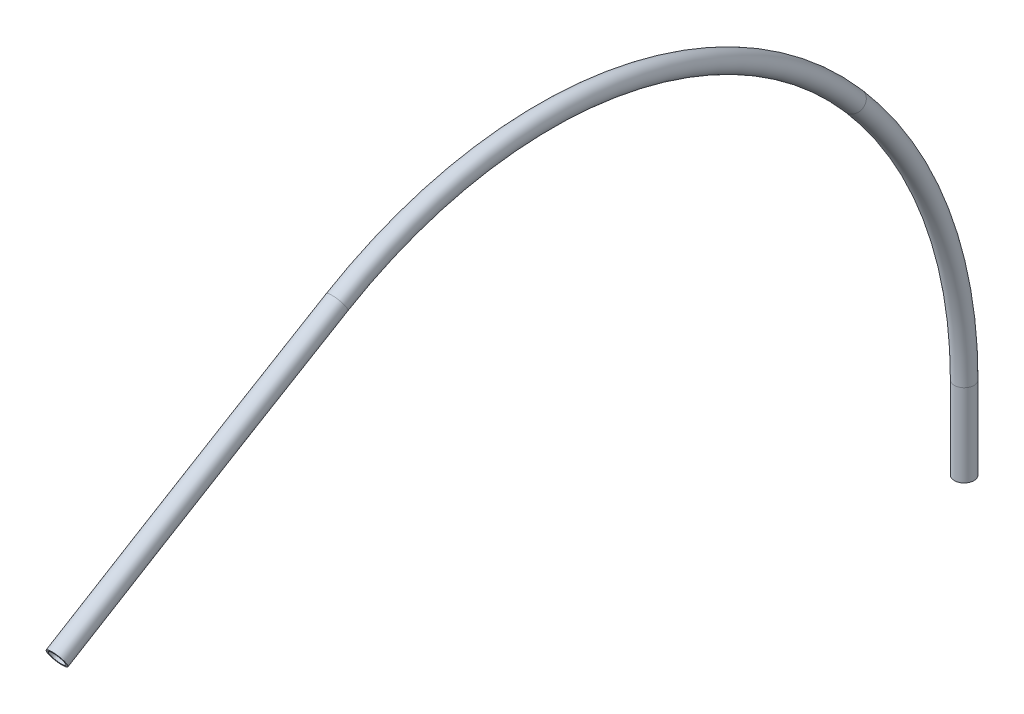
ISO-10303-21;
HEADER;
FILE_DESCRIPTION(('STEP AP214'),'2;1');
FILE_NAME('part.step','',(''),(''),'','','');
FILE_SCHEMA(('AUTOMOTIVE_DESIGN { 1 0 10303 214 1 1 1 1 }'));
ENDSEC;
DATA;
#1=APPLICATION_CONTEXT('core data for automotive mechanical design processes');
#2=APPLICATION_PROTOCOL_DEFINITION('international standard','automotive_design',2000,#1);
#3=PRODUCT_CONTEXT('',#1,'mechanical');
#4=PRODUCT('Part','Part','',(#3));
#5=PRODUCT_RELATED_PRODUCT_CATEGORY('part','',(#4));
#6=PRODUCT_DEFINITION_FORMATION('','',#4);
#7=PRODUCT_DEFINITION_CONTEXT('part definition',#1,'design');
#8=PRODUCT_DEFINITION('design','',#6,#7);
#9=PRODUCT_DEFINITION_SHAPE('','',#8);
#10=(LENGTH_UNIT() NAMED_UNIT(*) SI_UNIT(.MILLI.,.METRE.));
#11=(NAMED_UNIT(*) PLANE_ANGLE_UNIT() SI_UNIT($,.RADIAN.));
#12=(NAMED_UNIT(*) SI_UNIT($,.STERADIAN.) SOLID_ANGLE_UNIT());
#13=UNCERTAINTY_MEASURE_WITH_UNIT(LENGTH_MEASURE(1.E-05),#10,'distance_accuracy_value','');
#14=(GEOMETRIC_REPRESENTATION_CONTEXT(3) GLOBAL_UNCERTAINTY_ASSIGNED_CONTEXT((#13)) GLOBAL_UNIT_ASSIGNED_CONTEXT((#10,
#11,#12)) REPRESENTATION_CONTEXT('',''));
#15=CARTESIAN_POINT('',(0.,0.,0.));
#16=DIRECTION('',(0.,0.,1.));
#17=DIRECTION('',(1.,0.,0.));
#18=AXIS2_PLACEMENT_3D('',#15,#16,#17);
#19=CARTESIAN_POINT('',(0.,-11016.717542219,-6364.23470529255));
#20=DIRECTION('',(1.,0.,0.));
#21=DIRECTION('',(0.,0.,-1.));
#22=AXIS2_PLACEMENT_3D('',#19,#20,#21);
#23=TOROIDAL_SURFACE('',#22,13130.1715772297,5.);
#24=CARTESIAN_POINT('',(0.,277.064656452834,332.92060845467));
#25=DIRECTION('',(0.,-0.510058476719484,0.860139727210992));
#26=DIRECTION('',(0.,-0.860139727210992,-0.510058476719484));
#27=AXIS2_PLACEMENT_3D('',#24,#25,#26);
#28=CIRCLE('',#27,5.);
#29=CARTESIAN_POINT('',(0.,281.365355088891,335.470900838268));
#30=VERTEX_POINT('',#29);
#31=EDGE_CURVE('E38',#30,#30,#28,.T.);
#32=CARTESIAN_POINT('',(0.,190.846879685451,476.226198502676));
#33=DIRECTION('',(0.,-0.520972697390943,0.853573341062855));
#34=DIRECTION('',(0.,-0.853573341062855,-0.520972697390943));
#35=AXIS2_PLACEMENT_3D('',#32,#33,#34);
#36=CIRCLE('',#35,5.);
#37=CARTESIAN_POINT('',(0.,195.114746390765,478.83106198963));
#38=VERTEX_POINT('',#37);
#39=EDGE_CURVE('E10',#38,#38,#36,.T.);
#40=CARTESIAN_POINT('',(0.,-11016.717542219,-6364.23470529255));
#41=DIRECTION('',(1.,0.,0.));
#42=DIRECTION('',(0.,0.,-1.));
#43=AXIS2_PLACEMENT_3D('',#40,#41,#42);
#44=CIRCLE('',#43,13135.1715772297);
#45=EDGE_CURVE('',#30,#38,#44,.T.);
#46=ORIENTED_EDGE('',*,*,#31,.T.);
#47=ORIENTED_EDGE('',*,*,#39,.F.);
#48=ORIENTED_EDGE('',*,*,#45,.T.);
#49=ORIENTED_EDGE('',*,*,#45,.F.);
#50=EDGE_LOOP('',(#46,#48,#47,#49));
#51=FACE_BOUND('',#50,.T.);
#52=ADVANCED_FACE('F32',(#51),#23,.T.);
#53=CARTESIAN_POINT('',(0.,97.5047973276832,226.442526664043));
#54=DIRECTION('',(1.,0.,0.));
#55=DIRECTION('',(0.,0.,-1.));
#56=AXIS2_PLACEMENT_3D('',#53,#54,#55);
#57=TOROIDAL_SURFACE('',#56,208.756616448091,5.);
#58=CARTESIAN_POINT('',(0.,233.840270104142,68.3540584771607));
#59=DIRECTION('',(0.,0.757286024638133,0.653083361361911));
#60=DIRECTION('',(0.,-0.653083361361911,0.757286024638133));
#61=AXIS2_PLACEMENT_3D('',#58,#59,#60);
#62=CIRCLE('',#61,5.);
#63=CARTESIAN_POINT('',(0.,237.105686910951,64.56762835397));
#64=VERTEX_POINT('',#63);
#65=EDGE_CURVE('E42',#64,#64,#62,.T.);
#66=CARTESIAN_POINT('',(0.,97.5047973276832,226.442526664043));
#67=DIRECTION('',(1.,0.,0.));
#68=DIRECTION('',(0.,0.,-1.));
#69=AXIS2_PLACEMENT_3D('',#66,#67,#68);
#70=CIRCLE('',#69,213.756616448091);
#71=EDGE_CURVE('',#64,#30,#70,.T.);
#72=ORIENTED_EDGE('',*,*,#65,.T.);
#73=ORIENTED_EDGE('',*,*,#31,.F.);
#74=ORIENTED_EDGE('',*,*,#71,.T.);
#75=ORIENTED_EDGE('',*,*,#71,.F.);
#76=EDGE_LOOP('',(#72,#74,#73,#75));
#77=FACE_BOUND('',#76,.T.);
#78=ADVANCED_FACE('F94',(#77),#57,.T.);
#79=CARTESIAN_POINT('',(0.,82.2054172623216,244.182998087117));
#80=DIRECTION('',(1.,0.,0.));
#81=DIRECTION('',(0.,0.,-1.));
#82=AXIS2_PLACEMENT_3D('',#79,#80,#81);
#83=TOROIDAL_SURFACE('',#82,232.182998087117,5.);
#84=CARTESIAN_POINT('',(0.,82.2054172623216,12.));
#85=DIRECTION('',(0.,1.,0.));
#86=DIRECTION('',(0.,0.,1.));
#87=AXIS2_PLACEMENT_3D('',#84,#85,#86);
#88=CIRCLE('',#87,5.);
#89=CARTESIAN_POINT('',(0.,82.2054172623216,7.00000000000001));
#90=VERTEX_POINT('',#89);
#91=EDGE_CURVE('E46',#90,#90,#88,.T.);
#92=CARTESIAN_POINT('',(0.,82.2054172623216,244.182998087117));
#93=DIRECTION('',(1.,0.,0.));
#94=DIRECTION('',(0.,0.,-1.));
#95=AXIS2_PLACEMENT_3D('',#92,#93,#94);
#96=CIRCLE('',#95,237.182998087117);
#97=EDGE_CURVE('',#90,#64,#96,.T.);
#98=ORIENTED_EDGE('',*,*,#91,.T.);
#99=ORIENTED_EDGE('',*,*,#65,.F.);
#100=ORIENTED_EDGE('',*,*,#97,.T.);
#101=ORIENTED_EDGE('',*,*,#97,.F.);
#102=EDGE_LOOP('',(#98,#100,#99,#101));
#103=FACE_BOUND('',#102,.T.);
#104=ADVANCED_FACE('F89',(#103),#83,.T.);
#105=CARTESIAN_POINT('',(0.,82.2054172623216,12.));
#106=DIRECTION('',(0.,-1.,0.));
#107=DIRECTION('',(0.,0.,-1.));
#108=AXIS2_PLACEMENT_3D('',#105,#106,#107);
#109=CYLINDRICAL_SURFACE('',#108,5.);
#110=ORIENTED_EDGE('',*,*,#91,.F.);
#111=EDGE_LOOP('',(#110));
#112=FACE_BOUND('',#111,.T.);
#113=CARTESIAN_POINT('',(0.,40.,12.));
#114=DIRECTION('',(0.,1.,0.));
#115=DIRECTION('',(0.,0.,1.));
#116=AXIS2_PLACEMENT_3D('',#113,#114,#115);
#117=CIRCLE('',#116,5.);
#118=CARTESIAN_POINT('',(0.,40.,17.));
#119=VERTEX_POINT('',#118);
#120=EDGE_CURVE('E49',#119,#119,#117,.T.);
#121=ORIENTED_EDGE('',*,*,#120,.T.);
#122=EDGE_LOOP('',(#121));
#123=FACE_BOUND('',#122,.T.);
#124=ADVANCED_FACE('F81',(#112,#123),#109,.T.);
#125=CARTESIAN_POINT('',(0.,190.846879685451,476.226198502676));
#126=DIRECTION('',(0.,-0.520972697390943,0.853573341062855));
#127=DIRECTION('',(0.,-0.853573341062855,-0.520972697390943));
#128=AXIS2_PLACEMENT_3D('',#125,#126,#127);
#129=PLANE('',#128);
#130=CARTESIAN_POINT('',(0.,190.846879685449,476.226198502679));
#131=DIRECTION('',(0.,-0.520972697390943,0.853573341062855));
#132=DIRECTION('',(0.,-0.853573341062855,-0.520972697390943));
#133=AXIS2_PLACEMENT_3D('',#130,#131,#132);
#134=CIRCLE('',#133,4.);
#135=CARTESIAN_POINT('',(0.,194.261173049698,478.310089292242));
#136=VERTEX_POINT('',#135);
#137=EDGE_CURVE('E52',#136,#136,#134,.T.);
#138=ORIENTED_EDGE('',*,*,#137,.F.);
#139=EDGE_LOOP('',(#138));
#140=FACE_BOUND('',#139,.T.);
#141=ORIENTED_EDGE('',*,*,#39,.T.);
#142=EDGE_LOOP('',(#141));
#143=FACE_BOUND('',#142,.T.);
#144=ADVANCED_FACE('F79',(#140,#143),#129,.T.);
#145=CARTESIAN_POINT('',(0.,40.,12.));
#146=DIRECTION('',(0.,1.,0.));
#147=DIRECTION('',(0.,0.,1.));
#148=AXIS2_PLACEMENT_3D('',#145,#146,#147);
#149=PLANE('',#148);
#150=CARTESIAN_POINT('',(0.,40.,12.));
#151=DIRECTION('',(0.,1.,0.));
#152=DIRECTION('',(0.,0.,1.));
#153=AXIS2_PLACEMENT_3D('',#150,#151,#152);
#154=CIRCLE('',#153,4.);
#155=CARTESIAN_POINT('',(0.,40.,16.));
#156=VERTEX_POINT('',#155);
#157=EDGE_CURVE('E55',#156,#156,#154,.T.);
#158=ORIENTED_EDGE('',*,*,#157,.T.);
#159=EDGE_LOOP('',(#158));
#160=FACE_BOUND('',#159,.T.);
#161=ORIENTED_EDGE('',*,*,#120,.F.);
#162=EDGE_LOOP('',(#161));
#163=FACE_BOUND('',#162,.T.);
#164=ADVANCED_FACE('F75',(#160,#163),#149,.F.);
#165=CARTESIAN_POINT('',(0.,-11016.717542219,-6364.23470529255));
#166=DIRECTION('',(1.,0.,0.));
#167=DIRECTION('',(0.,0.,-1.));
#168=AXIS2_PLACEMENT_3D('',#165,#166,#167);
#169=TOROIDAL_SURFACE('',#168,13130.1715772297,4.);
#170=CARTESIAN_POINT('',(0.,277.064656452835,332.92060845467));
#171=DIRECTION('',(0.,0.510058476719484,-0.860139727210992));
#172=DIRECTION('',(0.,0.860139727210992,0.510058476719484));
#173=AXIS2_PLACEMENT_3D('',#170,#171,#172);
#174=CIRCLE('',#173,4.);
#175=CARTESIAN_POINT('',(0.,280.505215361678,334.960842361548));
#176=VERTEX_POINT('',#175);
#177=EDGE_CURVE('E61',#176,#176,#174,.F.);
#178=CARTESIAN_POINT('',(0.,-11016.717542219,-6364.23470529255));
#179=DIRECTION('',(1.,0.,0.));
#180=DIRECTION('',(0.,0.,-1.));
#181=AXIS2_PLACEMENT_3D('',#178,#179,#180);
#182=CIRCLE('',#181,13134.1715772297);
#183=EDGE_CURVE('',#176,#136,#182,.T.);
#184=ORIENTED_EDGE('',*,*,#177,.F.);
#185=ORIENTED_EDGE('',*,*,#137,.T.);
#186=ORIENTED_EDGE('',*,*,#183,.T.);
#187=ORIENTED_EDGE('',*,*,#183,.F.);
#188=EDGE_LOOP('',(#184,#186,#185,#187));
#189=FACE_BOUND('',#188,.T.);
#190=ADVANCED_FACE('F72',(#189),#169,.F.);
#191=CARTESIAN_POINT('',(0.,97.5047973276832,226.442526664043));
#192=DIRECTION('',(1.,0.,0.));
#193=DIRECTION('',(0.,0.,-1.));
#194=AXIS2_PLACEMENT_3D('',#191,#192,#193);
#195=TOROIDAL_SURFACE('',#194,208.756616448091,4.);
#196=CARTESIAN_POINT('',(0.,233.840270104142,68.3540584771607));
#197=DIRECTION('',(0.,-0.757286024638133,-0.653083361361911));
#198=DIRECTION('',(0.,0.653083361361911,-0.757286024638133));
#199=AXIS2_PLACEMENT_3D('',#196,#197,#198);
#200=CIRCLE('',#199,4.);
#201=CARTESIAN_POINT('',(0.,236.452603549589,65.3249143786082));
#202=VERTEX_POINT('',#201);
#203=EDGE_CURVE('E64',#202,#202,#200,.F.);
#204=CARTESIAN_POINT('',(0.,97.5047973276832,226.442526664043));
#205=DIRECTION('',(1.,0.,0.));
#206=DIRECTION('',(0.,0.,-1.));
#207=AXIS2_PLACEMENT_3D('',#204,#205,#206);
#208=CIRCLE('',#207,212.756616448091);
#209=EDGE_CURVE('',#202,#176,#208,.T.);
#210=ORIENTED_EDGE('',*,*,#203,.F.);
#211=ORIENTED_EDGE('',*,*,#177,.T.);
#212=ORIENTED_EDGE('',*,*,#209,.T.);
#213=ORIENTED_EDGE('',*,*,#209,.F.);
#214=EDGE_LOOP('',(#210,#212,#211,#213));
#215=FACE_BOUND('',#214,.T.);
#216=ADVANCED_FACE('F70',(#215),#195,.F.);
#217=CARTESIAN_POINT('',(0.,82.2054172623216,244.182998087117));
#218=DIRECTION('',(1.,0.,0.));
#219=DIRECTION('',(0.,0.,-1.));
#220=AXIS2_PLACEMENT_3D('',#217,#218,#219);
#221=TOROIDAL_SURFACE('',#220,232.182998087117,4.);
#222=CARTESIAN_POINT('',(0.,82.2054172623216,12.));
#223=DIRECTION('',(0.,-1.,0.));
#224=DIRECTION('',(0.,0.,-1.));
#225=AXIS2_PLACEMENT_3D('',#222,#223,#224);
#226=CIRCLE('',#225,4.);
#227=CARTESIAN_POINT('',(0.,82.2054172623216,8.00000000000001));
#228=VERTEX_POINT('',#227);
#229=EDGE_CURVE('E58',#228,#228,#226,.F.);
#230=CARTESIAN_POINT('',(0.,82.2054172623216,244.182998087117));
#231=DIRECTION('',(1.,0.,0.));
#232=DIRECTION('',(0.,0.,-1.));
#233=AXIS2_PLACEMENT_3D('',#230,#231,#232);
#234=CIRCLE('',#233,236.182998087117);
#235=EDGE_CURVE('',#228,#202,#234,.T.);
#236=ORIENTED_EDGE('',*,*,#229,.F.);
#237=ORIENTED_EDGE('',*,*,#203,.T.);
#238=ORIENTED_EDGE('',*,*,#235,.T.);
#239=ORIENTED_EDGE('',*,*,#235,.F.);
#240=EDGE_LOOP('',(#236,#238,#237,#239));
#241=FACE_BOUND('',#240,.T.);
#242=ADVANCED_FACE('F143',(#241),#221,.F.);
#243=CARTESIAN_POINT('',(0.,82.2054172623216,12.));
#244=DIRECTION('',(0.,-1.,0.));
#245=DIRECTION('',(0.,0.,-1.));
#246=AXIS2_PLACEMENT_3D('',#243,#244,#245);
#247=CYLINDRICAL_SURFACE('',#246,4.);
#248=ORIENTED_EDGE('',*,*,#229,.T.);
#249=EDGE_LOOP('',(#248));
#250=FACE_BOUND('',#249,.T.);
#251=ORIENTED_EDGE('',*,*,#157,.F.);
#252=EDGE_LOOP('',(#251));
#253=FACE_BOUND('',#252,.T.);
#254=ADVANCED_FACE('F153',(#250,#253),#247,.F.);
#255=CLOSED_SHELL('',(#52,#78,#104,#124,#144,#164,#190,#216,#242,#254));
#256=MANIFOLD_SOLID_BREP('B2',#255);
#257=ADVANCED_BREP_SHAPE_REPRESENTATION('',(#18,#256),#14);
#258=SHAPE_DEFINITION_REPRESENTATION(#9,#257);
ENDSEC;
END-ISO-10303-21;
